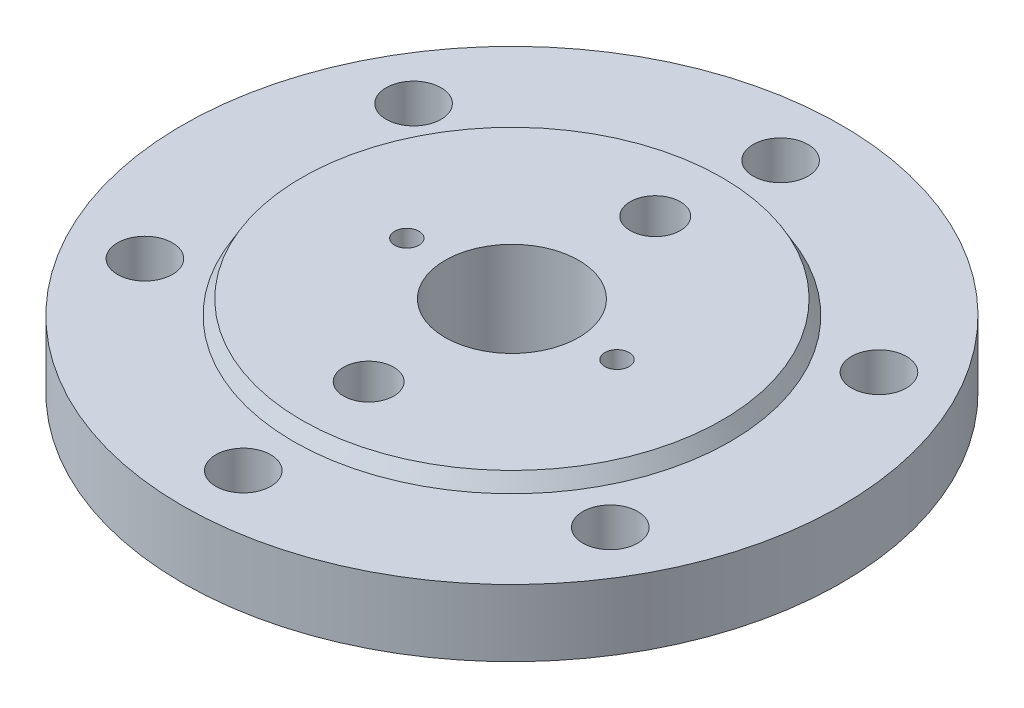
ISO-10303-21;
HEADER;
FILE_DESCRIPTION(('STEP AP214'),'2;1');
FILE_NAME('part.step','',(''),(''),'','','');
FILE_SCHEMA(('AUTOMOTIVE_DESIGN { 1 0 10303 214 1 1 1 1 }'));
ENDSEC;
DATA;
#1=APPLICATION_CONTEXT('core data for automotive mechanical design processes');
#2=APPLICATION_PROTOCOL_DEFINITION('international standard','automotive_design',2000,#1);
#3=PRODUCT_CONTEXT('',#1,'mechanical');
#4=PRODUCT('Part','Part','',(#3));
#5=PRODUCT_RELATED_PRODUCT_CATEGORY('part','',(#4));
#6=PRODUCT_DEFINITION_FORMATION('','',#4);
#7=PRODUCT_DEFINITION_CONTEXT('part definition',#1,'design');
#8=PRODUCT_DEFINITION('design','',#6,#7);
#9=PRODUCT_DEFINITION_SHAPE('','',#8);
#10=(LENGTH_UNIT() NAMED_UNIT(*) SI_UNIT(.MILLI.,.METRE.));
#11=(NAMED_UNIT(*) PLANE_ANGLE_UNIT() SI_UNIT($,.RADIAN.));
#12=(NAMED_UNIT(*) SI_UNIT($,.STERADIAN.) SOLID_ANGLE_UNIT());
#13=UNCERTAINTY_MEASURE_WITH_UNIT(LENGTH_MEASURE(1.E-05),#10,'distance_accuracy_value','');
#14=(GEOMETRIC_REPRESENTATION_CONTEXT(3) GLOBAL_UNCERTAINTY_ASSIGNED_CONTEXT((#13)) GLOBAL_UNIT_ASSIGNED_CONTEXT((#10,
#11,#12)) REPRESENTATION_CONTEXT('',''));
#15=CARTESIAN_POINT('',(0.,0.,0.));
#16=DIRECTION('',(0.,0.,1.));
#17=DIRECTION('',(1.,0.,0.));
#18=AXIS2_PLACEMENT_3D('',#15,#16,#17);
#19=CARTESIAN_POINT('',(35.,-37.771370899436,0.));
#20=DIRECTION('',(0.,1.,0.));
#21=DIRECTION('',(0.,0.,1.));
#22=AXIS2_PLACEMENT_3D('',#19,#20,#21);
#23=PLANE('',#22);
#24=CARTESIAN_POINT('',(0.,-37.771370899436,0.));
#25=DIRECTION('',(0.,1.,0.));
#26=DIRECTION('',(0.,0.,1.));
#27=AXIS2_PLACEMENT_3D('',#24,#25,#26);
#28=CIRCLE('',#27,35.);
#29=CARTESIAN_POINT('',(0.,-37.771370899436,35.));
#30=VERTEX_POINT('',#29);
#31=EDGE_CURVE('E102',#30,#30,#28,.T.);
#32=ORIENTED_EDGE('',*,*,#31,.F.);
#33=EDGE_LOOP('',(#32));
#34=FACE_BOUND('',#33,.T.);
#35=CARTESIAN_POINT('',(0.,-37.771370899436,0.));
#36=DIRECTION('',(0.,1.,0.));
#37=DIRECTION('',(0.,0.,1.));
#38=AXIS2_PLACEMENT_3D('',#35,#36,#37);
#39=CIRCLE('',#38,14.);
#40=CARTESIAN_POINT('',(0.,-37.771370899436,14.));
#41=VERTEX_POINT('',#40);
#42=EDGE_CURVE('E11',#41,#41,#39,.T.);
#43=ORIENTED_EDGE('',*,*,#42,.T.);
#44=EDGE_LOOP('',(#43));
#45=FACE_BOUND('',#44,.T.);
#46=ADVANCED_FACE('F41',(#34,#45),#23,.F.);
#47=CARTESIAN_POINT('',(0.,62.9923492162756,0.));
#48=DIRECTION('',(0.,1.,0.));
#49=DIRECTION('',(0.,0.,1.));
#50=AXIS2_PLACEMENT_3D('',#47,#48,#49);
#51=CYLINDRICAL_SURFACE('',#50,14.);
#52=ORIENTED_EDGE('',*,*,#42,.F.);
#53=EDGE_LOOP('',(#52));
#54=FACE_BOUND('',#53,.T.);
#55=CARTESIAN_POINT('',(0.,-8.70491317374995,0.));
#56=DIRECTION('',(0.,1.,0.));
#57=DIRECTION('',(0.,0.,1.));
#58=AXIS2_PLACEMENT_3D('',#55,#56,#57);
#59=CIRCLE('',#58,14.);
#60=CARTESIAN_POINT('',(0.,-8.70491317374995,14.));
#61=VERTEX_POINT('',#60);
#62=EDGE_CURVE('E48',#61,#61,#59,.T.);
#63=ORIENTED_EDGE('',*,*,#62,.T.);
#64=EDGE_LOOP('',(#63));
#65=FACE_BOUND('',#64,.T.);
#66=ADVANCED_FACE('F159',(#54,#65),#51,.F.);
#67=CARTESIAN_POINT('',(0.,-0.622009405095103,0.));
#68=DIRECTION('',(0.,1.,0.));
#69=DIRECTION('',(0.,0.,1.));
#70=AXIS2_PLACEMENT_3D('',#67,#68,#69);
#71=CONICAL_SURFACE('',#70,28.,1.04719755119659);
#72=ORIENTED_EDGE('',*,*,#62,.F.);
#73=EDGE_LOOP('',(#72));
#74=FACE_BOUND('',#73,.T.);
#75=CARTESIAN_POINT('',(0.,-0.622009405095103,0.));
#76=DIRECTION('',(0.,1.,0.));
#77=DIRECTION('',(0.,0.,1.));
#78=AXIS2_PLACEMENT_3D('',#75,#76,#77);
#79=CIRCLE('',#78,28.);
#80=CARTESIAN_POINT('',(0.,-0.622009405095103,28.));
#81=VERTEX_POINT('',#80);
#82=EDGE_CURVE('E154',#81,#81,#79,.T.);
#83=ORIENTED_EDGE('',*,*,#82,.T.);
#84=EDGE_LOOP('',(#83));
#85=FACE_BOUND('',#84,.T.);
#86=ADVANCED_FACE('F161',(#74,#85),#71,.F.);
#87=CARTESIAN_POINT('',(0.,62.9923492162756,0.));
#88=DIRECTION('',(0.,1.,0.));
#89=DIRECTION('',(0.,0.,1.));
#90=AXIS2_PLACEMENT_3D('',#87,#88,#89);
#91=CYLINDRICAL_SURFACE('',#90,28.);
#92=ORIENTED_EDGE('',*,*,#82,.F.);
#93=EDGE_LOOP('',(#92));
#94=FACE_BOUND('',#93,.T.);
#95=CARTESIAN_POINT('',(0.,49.228629100564,0.));
#96=DIRECTION('',(0.,1.,0.));
#97=DIRECTION('',(0.,0.,1.));
#98=AXIS2_PLACEMENT_3D('',#95,#96,#97);
#99=CIRCLE('',#98,28.);
#100=CARTESIAN_POINT('',(0.,49.228629100564,28.));
#101=VERTEX_POINT('',#100);
#102=EDGE_CURVE('E151',#101,#101,#99,.T.);
#103=ORIENTED_EDGE('',*,*,#102,.T.);
#104=EDGE_LOOP('',(#103));
#105=FACE_BOUND('',#104,.T.);
#106=ADVANCED_FACE('F164',(#94,#105),#91,.F.);
#107=CARTESIAN_POINT('',(28.,49.2286291005639,0.));
#108=DIRECTION('',(0.,-1.,0.));
#109=DIRECTION('',(0.,0.,-1.));
#110=AXIS2_PLACEMENT_3D('',#107,#108,#109);
#111=PLANE('',#110);
#112=CARTESIAN_POINT('',(-44.,49.2286291005639,0.));
#113=DIRECTION('',(0.,1.,0.));
#114=DIRECTION('',(0.,0.,1.));
#115=AXIS2_PLACEMENT_3D('',#112,#113,#114);
#116=CIRCLE('',#115,5.09999999999999);
#117=CARTESIAN_POINT('',(-44.,49.2286291005639,5.09999999999999));
#118=VERTEX_POINT('',#117);
#119=EDGE_CURVE('E72',#118,#118,#116,.T.);
#120=ORIENTED_EDGE('',*,*,#119,.F.);
#121=EDGE_LOOP('',(#120));
#122=FACE_BOUND('',#121,.T.);
#123=CARTESIAN_POINT('',(44.,49.2286291005639,0.));
#124=DIRECTION('',(0.,1.,0.));
#125=DIRECTION('',(0.,0.,1.));
#126=AXIS2_PLACEMENT_3D('',#123,#124,#125);
#127=CIRCLE('',#126,5.09999999999999);
#128=CARTESIAN_POINT('',(44.,49.2286291005639,5.09999999999999));
#129=VERTEX_POINT('',#128);
#130=EDGE_CURVE('E71',#129,#129,#127,.T.);
#131=ORIENTED_EDGE('',*,*,#130,.F.);
#132=EDGE_LOOP('',(#131));
#133=FACE_BOUND('',#132,.T.);
#134=CARTESIAN_POINT('',(0.,49.2286291005639,-60.));
#135=DIRECTION('',(0.,1.,0.));
#136=DIRECTION('',(0.,0.,1.));
#137=AXIS2_PLACEMENT_3D('',#134,#135,#136);
#138=CIRCLE('',#137,10.5);
#139=CARTESIAN_POINT('',(0.,49.2286291005639,-49.5));
#140=VERTEX_POINT('',#139);
#141=EDGE_CURVE('E82',#140,#140,#138,.T.);
#142=ORIENTED_EDGE('',*,*,#141,.F.);
#143=EDGE_LOOP('',(#142));
#144=FACE_BOUND('',#143,.T.);
#145=CARTESIAN_POINT('',(0.,49.2286291005639,60.));
#146=DIRECTION('',(0.,1.,0.));
#147=DIRECTION('',(0.,0.,1.));
#148=AXIS2_PLACEMENT_3D('',#145,#146,#147);
#149=CIRCLE('',#148,10.5);
#150=CARTESIAN_POINT('',(0.,49.2286291005639,70.5));
#151=VERTEX_POINT('',#150);
#152=EDGE_CURVE('E88',#151,#151,#149,.T.);
#153=ORIENTED_EDGE('',*,*,#152,.F.);
#154=EDGE_LOOP('',(#153));
#155=FACE_BOUND('',#154,.T.);
#156=ORIENTED_EDGE('',*,*,#102,.F.);
#157=EDGE_LOOP('',(#156));
#158=FACE_BOUND('',#157,.T.);
#159=CARTESIAN_POINT('',(0.,49.2286291005637,0.));
#160=DIRECTION('',(0.,1.,0.));
#161=DIRECTION('',(0.,0.,1.));
#162=AXIS2_PLACEMENT_3D('',#159,#160,#161);
#163=CIRCLE('',#162,87.9999999999995);
#164=CARTESIAN_POINT('',(0.,49.2286291005637,87.9999999999995));
#165=VERTEX_POINT('',#164);
#166=EDGE_CURVE('E148',#165,#165,#163,.T.);
#167=ORIENTED_EDGE('',*,*,#166,.T.);
#168=EDGE_LOOP('',(#167));
#169=FACE_BOUND('',#168,.T.);
#170=ADVANCED_FACE('F170',(#122,#133,#144,#155,#158,#169),#111,.F.);
#171=CARTESIAN_POINT('',(0.,43.2286291005637,0.));
#172=DIRECTION('',(0.,-1.,0.));
#173=DIRECTION('',(0.,0.,-1.));
#174=AXIS2_PLACEMENT_3D('',#171,#172,#173);
#175=CONICAL_SURFACE('',#174,91.4641016151374,0.523598775598304);
#176=ORIENTED_EDGE('',*,*,#166,.F.);
#177=EDGE_LOOP('',(#176));
#178=FACE_BOUND('',#177,.T.);
#179=CARTESIAN_POINT('',(0.,43.2286291005637,0.));
#180=DIRECTION('',(0.,1.,0.));
#181=DIRECTION('',(0.,0.,1.));
#182=AXIS2_PLACEMENT_3D('',#179,#180,#181);
#183=CIRCLE('',#182,91.4641016151374);
#184=CARTESIAN_POINT('',(0.,43.2286291005637,91.4641016151374));
#185=VERTEX_POINT('',#184);
#186=EDGE_CURVE('E145',#185,#185,#183,.T.);
#187=ORIENTED_EDGE('',*,*,#186,.T.);
#188=EDGE_LOOP('',(#187));
#189=FACE_BOUND('',#188,.T.);
#190=ADVANCED_FACE('F176',(#178,#189),#175,.T.);
#191=CARTESIAN_POINT('',(91.4641016151374,43.2286291005639,0.));
#192=DIRECTION('',(0.,-1.,0.));
#193=DIRECTION('',(0.,0.,-1.));
#194=AXIS2_PLACEMENT_3D('',#191,#192,#193);
#195=PLANE('',#194);
#196=CARTESIAN_POINT('',(0.,43.2286291005639,-112.5));
#197=DIRECTION('',(0.,1.,0.));
#198=DIRECTION('',(0.,0.,1.));
#199=AXIS2_PLACEMENT_3D('',#196,#197,#198);
#200=CIRCLE('',#199,11.5);
#201=CARTESIAN_POINT('',(0.,43.2286291005639,-101.));
#202=VERTEX_POINT('',#201);
#203=EDGE_CURVE('E95',#202,#202,#200,.T.);
#204=ORIENTED_EDGE('',*,*,#203,.F.);
#205=EDGE_LOOP('',(#204));
#206=FACE_BOUND('',#205,.T.);
#207=CARTESIAN_POINT('',(-97.4278579257454,43.2286291005639,-56.249999999993));
#208=DIRECTION('',(0.,1.,0.));
#209=DIRECTION('',(0.,0.,1.));
#210=AXIS2_PLACEMENT_3D('',#207,#208,#209);
#211=CIRCLE('',#210,11.5000000000072);
#212=CARTESIAN_POINT('',(-97.4278579257454,43.2286291005639,-44.7499999999858));
#213=VERTEX_POINT('',#212);
#214=EDGE_CURVE('E94',#213,#213,#211,.T.);
#215=ORIENTED_EDGE('',*,*,#214,.F.);
#216=EDGE_LOOP('',(#215));
#217=FACE_BOUND('',#216,.T.);
#218=CARTESIAN_POINT('',(-97.4278579257374,43.2286291005639,56.2500000000069));
#219=DIRECTION('',(0.,1.,0.));
#220=DIRECTION('',(0.,0.,1.));
#221=AXIS2_PLACEMENT_3D('',#218,#219,#220);
#222=CIRCLE('',#221,11.5000000000145);
#223=CARTESIAN_POINT('',(-97.4278579257374,43.2286291005639,67.7500000000214));
#224=VERTEX_POINT('',#223);
#225=EDGE_CURVE('E108',#224,#224,#222,.T.);
#226=ORIENTED_EDGE('',*,*,#225,.F.);
#227=EDGE_LOOP('',(#226));
#228=FACE_BOUND('',#227,.T.);
#229=CARTESIAN_POINT('',(1.5945879725131E-11,43.2286291005639,112.5));
#230=DIRECTION('',(0.,1.,0.));
#231=DIRECTION('',(0.,0.,1.));
#232=AXIS2_PLACEMENT_3D('',#229,#230,#231);
#233=CIRCLE('',#232,11.500000000016);
#234=CARTESIAN_POINT('',(1.5945879725131E-11,43.2286291005639,124.000000000016));
#235=VERTEX_POINT('',#234);
#236=EDGE_CURVE('E121',#235,#235,#233,.T.);
#237=ORIENTED_EDGE('',*,*,#236,.F.);
#238=EDGE_LOOP('',(#237));
#239=FACE_BOUND('',#238,.T.);
#240=CARTESIAN_POINT('',(97.4278579257613,43.2286291005639,56.2499999999931));
#241=DIRECTION('',(0.,1.,0.));
#242=DIRECTION('',(0.,0.,1.));
#243=AXIS2_PLACEMENT_3D('',#240,#241,#242);
#244=CIRCLE('',#243,11.50000000001);
#245=CARTESIAN_POINT('',(97.4278579257613,43.2286291005639,67.750000000003));
#246=VERTEX_POINT('',#245);
#247=EDGE_CURVE('E115',#246,#246,#244,.T.);
#248=ORIENTED_EDGE('',*,*,#247,.F.);
#249=EDGE_LOOP('',(#248));
#250=FACE_BOUND('',#249,.T.);
#251=CARTESIAN_POINT('',(97.4278579257533,43.2286291005639,-56.2500000000069));
#252=DIRECTION('',(0.,1.,0.));
#253=DIRECTION('',(0.,0.,1.));
#254=AXIS2_PLACEMENT_3D('',#251,#252,#253);
#255=CIRCLE('',#254,11.5000000000021);
#256=CARTESIAN_POINT('',(97.4278579257533,43.2286291005639,-44.7500000000049));
#257=VERTEX_POINT('',#256);
#258=EDGE_CURVE('E109',#257,#257,#255,.T.);
#259=ORIENTED_EDGE('',*,*,#258,.F.);
#260=EDGE_LOOP('',(#259));
#261=FACE_BOUND('',#260,.T.);
#262=ORIENTED_EDGE('',*,*,#186,.F.);
#263=EDGE_LOOP('',(#262));
#264=FACE_BOUND('',#263,.T.);
#265=CARTESIAN_POINT('',(0.,43.228629100564,0.));
#266=DIRECTION('',(0.,1.,0.));
#267=DIRECTION('',(0.,0.,1.));
#268=AXIS2_PLACEMENT_3D('',#265,#266,#267);
#269=CIRCLE('',#268,138.);
#270=CARTESIAN_POINT('',(0.,43.228629100564,138.));
#271=VERTEX_POINT('',#270);
#272=EDGE_CURVE('E142',#271,#271,#269,.T.);
#273=ORIENTED_EDGE('',*,*,#272,.T.);
#274=EDGE_LOOP('',(#273));
#275=FACE_BOUND('',#274,.T.);
#276=ADVANCED_FACE('F183',(#206,#217,#228,#239,#250,#261,#264,#275),#195,.F.);
#277=CARTESIAN_POINT('',(0.,62.9923492162756,0.));
#278=DIRECTION('',(0.,1.,0.));
#279=DIRECTION('',(0.,0.,1.));
#280=AXIS2_PLACEMENT_3D('',#277,#278,#279);
#281=CYLINDRICAL_SURFACE('',#280,138.);
#282=ORIENTED_EDGE('',*,*,#272,.F.);
#283=EDGE_LOOP('',(#282));
#284=FACE_BOUND('',#283,.T.);
#285=CARTESIAN_POINT('',(0.,15.228629100564,0.));
#286=DIRECTION('',(0.,1.,0.));
#287=DIRECTION('',(0.,0.,1.));
#288=AXIS2_PLACEMENT_3D('',#285,#286,#287);
#289=CIRCLE('',#288,138.);
#290=CARTESIAN_POINT('',(0.,15.228629100564,138.));
#291=VERTEX_POINT('',#290);
#292=EDGE_CURVE('E139',#291,#291,#289,.T.);
#293=ORIENTED_EDGE('',*,*,#292,.T.);
#294=EDGE_LOOP('',(#293));
#295=FACE_BOUND('',#294,.T.);
#296=ADVANCED_FACE('F189',(#284,#295),#281,.T.);
#297=CARTESIAN_POINT('',(138.,15.228629100564,0.));
#298=DIRECTION('',(0.,1.,0.));
#299=DIRECTION('',(0.,0.,1.));
#300=AXIS2_PLACEMENT_3D('',#297,#298,#299);
#301=PLANE('',#300);
#302=CARTESIAN_POINT('',(0.,15.228629100564,-112.5));
#303=DIRECTION('',(0.,1.,0.));
#304=DIRECTION('',(0.,0.,1.));
#305=AXIS2_PLACEMENT_3D('',#302,#303,#304);
#306=CIRCLE('',#305,11.5);
#307=CARTESIAN_POINT('',(0.,15.228629100564,-101.));
#308=VERTEX_POINT('',#307);
#309=EDGE_CURVE('E98',#308,#308,#306,.F.);
#310=ORIENTED_EDGE('',*,*,#309,.F.);
#311=EDGE_LOOP('',(#310));
#312=FACE_BOUND('',#311,.T.);
#313=CARTESIAN_POINT('',(-97.4278579257454,15.228629100564,-56.249999999993));
#314=DIRECTION('',(0.,1.,0.));
#315=DIRECTION('',(0.,0.,1.));
#316=AXIS2_PLACEMENT_3D('',#313,#314,#315);
#317=CIRCLE('',#316,11.5000000000072);
#318=CARTESIAN_POINT('',(-97.4278579257454,15.228629100564,-44.7499999999858));
#319=VERTEX_POINT('',#318);
#320=EDGE_CURVE('E105',#319,#319,#317,.F.);
#321=ORIENTED_EDGE('',*,*,#320,.F.);
#322=EDGE_LOOP('',(#321));
#323=FACE_BOUND('',#322,.T.);
#324=CARTESIAN_POINT('',(-97.4278579257374,15.228629100564,56.2500000000069));
#325=DIRECTION('',(0.,1.,0.));
#326=DIRECTION('',(0.,0.,1.));
#327=AXIS2_PLACEMENT_3D('',#324,#325,#326);
#328=CIRCLE('',#327,11.5000000000145);
#329=CARTESIAN_POINT('',(-97.4278579257374,15.228629100564,67.7500000000214));
#330=VERTEX_POINT('',#329);
#331=EDGE_CURVE('E124',#330,#330,#328,.F.);
#332=ORIENTED_EDGE('',*,*,#331,.F.);
#333=EDGE_LOOP('',(#332));
#334=FACE_BOUND('',#333,.T.);
#335=CARTESIAN_POINT('',(1.5945879725131E-11,15.228629100564,112.5));
#336=DIRECTION('',(0.,1.,0.));
#337=DIRECTION('',(0.,0.,1.));
#338=AXIS2_PLACEMENT_3D('',#335,#336,#337);
#339=CIRCLE('',#338,11.500000000016);
#340=CARTESIAN_POINT('',(1.5945879725131E-11,15.228629100564,124.000000000016));
#341=VERTEX_POINT('',#340);
#342=EDGE_CURVE('E118',#341,#341,#339,.F.);
#343=ORIENTED_EDGE('',*,*,#342,.F.);
#344=EDGE_LOOP('',(#343));
#345=FACE_BOUND('',#344,.T.);
#346=CARTESIAN_POINT('',(97.4278579257613,15.228629100564,56.2499999999931));
#347=DIRECTION('',(0.,1.,0.));
#348=DIRECTION('',(0.,0.,1.));
#349=AXIS2_PLACEMENT_3D('',#346,#347,#348);
#350=CIRCLE('',#349,11.50000000001);
#351=CARTESIAN_POINT('',(97.4278579257613,15.228629100564,67.750000000003));
#352=VERTEX_POINT('',#351);
#353=EDGE_CURVE('E112',#352,#352,#350,.F.);
#354=ORIENTED_EDGE('',*,*,#353,.F.);
#355=EDGE_LOOP('',(#354));
#356=FACE_BOUND('',#355,.T.);
#357=CARTESIAN_POINT('',(97.4278579257533,15.228629100564,-56.2500000000069));
#358=DIRECTION('',(0.,1.,0.));
#359=DIRECTION('',(0.,0.,1.));
#360=AXIS2_PLACEMENT_3D('',#357,#358,#359);
#361=CIRCLE('',#360,11.5000000000021);
#362=CARTESIAN_POINT('',(97.4278579257533,15.228629100564,-44.7500000000049));
#363=VERTEX_POINT('',#362);
#364=EDGE_CURVE('E99',#363,#363,#361,.F.);
#365=ORIENTED_EDGE('',*,*,#364,.F.);
#366=EDGE_LOOP('',(#365));
#367=FACE_BOUND('',#366,.T.);
#368=ORIENTED_EDGE('',*,*,#292,.F.);
#369=EDGE_LOOP('',(#368));
#370=FACE_BOUND('',#369,.T.);
#371=CARTESIAN_POINT('',(0.,15.228629100564,0.));
#372=DIRECTION('',(0.,1.,0.));
#373=DIRECTION('',(0.,0.,1.));
#374=AXIS2_PLACEMENT_3D('',#371,#372,#373);
#375=CIRCLE('',#374,59.901806027542);
#376=CARTESIAN_POINT('',(0.,15.228629100564,59.901806027542));
#377=VERTEX_POINT('',#376);
#378=EDGE_CURVE('E136',#377,#377,#375,.T.);
#379=ORIENTED_EDGE('',*,*,#378,.T.);
#380=EDGE_LOOP('',(#379));
#381=FACE_BOUND('',#380,.T.);
#382=ADVANCED_FACE('F196',(#312,#323,#334,#345,#356,#367,#370,#381),#301,.F.);
#383=CARTESIAN_POINT('',(0.,62.9923492162756,0.));
#384=DIRECTION('',(0.,1.,0.));
#385=DIRECTION('',(0.,0.,1.));
#386=AXIS2_PLACEMENT_3D('',#383,#384,#385);
#387=CYLINDRICAL_SURFACE('',#386,59.901806027542);
#388=ORIENTED_EDGE('',*,*,#378,.F.);
#389=EDGE_LOOP('',(#388));
#390=FACE_BOUND('',#389,.T.);
#391=CARTESIAN_POINT('',(0.,9.22862910056398,0.));
#392=DIRECTION('',(0.,1.,0.));
#393=DIRECTION('',(0.,0.,1.));
#394=AXIS2_PLACEMENT_3D('',#391,#392,#393);
#395=CIRCLE('',#394,59.901806027542);
#396=CARTESIAN_POINT('',(0.,9.22862910056398,59.901806027542));
#397=VERTEX_POINT('',#396);
#398=EDGE_CURVE('E133',#397,#397,#395,.T.);
#399=ORIENTED_EDGE('',*,*,#398,.T.);
#400=EDGE_LOOP('',(#399));
#401=FACE_BOUND('',#400,.T.);
#402=ADVANCED_FACE('F202',(#390,#401),#387,.T.);
#403=CARTESIAN_POINT('',(0.,-37.771370899436,0.));
#404=DIRECTION('',(0.,1.,0.));
#405=DIRECTION('',(0.,0.,1.));
#406=AXIS2_PLACEMENT_3D('',#403,#404,#405);
#407=CONICAL_SURFACE('',#406,35.,0.487222462387778);
#408=ORIENTED_EDGE('',*,*,#398,.F.);
#409=EDGE_LOOP('',(#408));
#410=FACE_BOUND('',#409,.T.);
#411=ORIENTED_EDGE('',*,*,#31,.T.);
#412=EDGE_LOOP('',(#411));
#413=FACE_BOUND('',#412,.T.);
#414=ADVANCED_FACE('F209',(#410,#413),#407,.T.);
#415=CARTESIAN_POINT('',(97.4278579257533,-37.772370899436,-56.2500000000069));
#416=DIRECTION('',(0.,1.,0.));
#417=DIRECTION('',(0.,0.,1.));
#418=AXIS2_PLACEMENT_3D('',#415,#416,#417);
#419=CYLINDRICAL_SURFACE('',#418,11.5000000000021);
#420=ORIENTED_EDGE('',*,*,#258,.T.);
#421=EDGE_LOOP('',(#420));
#422=FACE_BOUND('',#421,.T.);
#423=ORIENTED_EDGE('',*,*,#364,.T.);
#424=EDGE_LOOP('',(#423));
#425=FACE_BOUND('',#424,.T.);
#426=ADVANCED_FACE('F215',(#422,#425),#419,.F.);
#427=CARTESIAN_POINT('',(97.4278579257613,-37.772370899436,56.2499999999931));
#428=DIRECTION('',(0.,1.,0.));
#429=DIRECTION('',(0.,0.,1.));
#430=AXIS2_PLACEMENT_3D('',#427,#428,#429);
#431=CYLINDRICAL_SURFACE('',#430,11.50000000001);
#432=ORIENTED_EDGE('',*,*,#247,.T.);
#433=EDGE_LOOP('',(#432));
#434=FACE_BOUND('',#433,.T.);
#435=ORIENTED_EDGE('',*,*,#353,.T.);
#436=EDGE_LOOP('',(#435));
#437=FACE_BOUND('',#436,.T.);
#438=ADVANCED_FACE('F235',(#434,#437),#431,.F.);
#439=CARTESIAN_POINT('',(1.5945879725131E-11,-37.772370899436,112.5));
#440=DIRECTION('',(0.,1.,0.));
#441=DIRECTION('',(0.,0.,1.));
#442=AXIS2_PLACEMENT_3D('',#439,#440,#441);
#443=CYLINDRICAL_SURFACE('',#442,11.500000000016);
#444=ORIENTED_EDGE('',*,*,#236,.T.);
#445=EDGE_LOOP('',(#444));
#446=FACE_BOUND('',#445,.T.);
#447=ORIENTED_EDGE('',*,*,#342,.T.);
#448=EDGE_LOOP('',(#447));
#449=FACE_BOUND('',#448,.T.);
#450=ADVANCED_FACE('F231',(#446,#449),#443,.F.);
#451=CARTESIAN_POINT('',(-97.4278579257374,-37.772370899436,56.2500000000069));
#452=DIRECTION('',(0.,1.,0.));
#453=DIRECTION('',(0.,0.,1.));
#454=AXIS2_PLACEMENT_3D('',#451,#452,#453);
#455=CYLINDRICAL_SURFACE('',#454,11.5000000000145);
#456=ORIENTED_EDGE('',*,*,#225,.T.);
#457=EDGE_LOOP('',(#456));
#458=FACE_BOUND('',#457,.T.);
#459=ORIENTED_EDGE('',*,*,#331,.T.);
#460=EDGE_LOOP('',(#459));
#461=FACE_BOUND('',#460,.T.);
#462=ADVANCED_FACE('F227',(#458,#461),#455,.F.);
#463=CARTESIAN_POINT('',(-97.4278579257454,-37.772370899436,-56.249999999993));
#464=DIRECTION('',(0.,1.,0.));
#465=DIRECTION('',(0.,0.,1.));
#466=AXIS2_PLACEMENT_3D('',#463,#464,#465);
#467=CYLINDRICAL_SURFACE('',#466,11.5000000000072);
#468=ORIENTED_EDGE('',*,*,#214,.T.);
#469=EDGE_LOOP('',(#468));
#470=FACE_BOUND('',#469,.T.);
#471=ORIENTED_EDGE('',*,*,#320,.T.);
#472=EDGE_LOOP('',(#471));
#473=FACE_BOUND('',#472,.T.);
#474=ADVANCED_FACE('F230',(#470,#473),#467,.F.);
#475=CARTESIAN_POINT('',(0.,-37.772370899436,-112.5));
#476=DIRECTION('',(0.,1.,0.));
#477=DIRECTION('',(0.,0.,1.));
#478=AXIS2_PLACEMENT_3D('',#475,#476,#477);
#479=CYLINDRICAL_SURFACE('',#478,11.5);
#480=ORIENTED_EDGE('',*,*,#203,.T.);
#481=EDGE_LOOP('',(#480));
#482=FACE_BOUND('',#481,.T.);
#483=ORIENTED_EDGE('',*,*,#309,.T.);
#484=EDGE_LOOP('',(#483));
#485=FACE_BOUND('',#484,.T.);
#486=ADVANCED_FACE('F245',(#482,#485),#479,.F.);
#487=CARTESIAN_POINT('',(0.,31.5376656003532,60.));
#488=DIRECTION('',(0.,1.,0.));
#489=DIRECTION('',(0.,0.,1.));
#490=AXIS2_PLACEMENT_3D('',#487,#488,#489);
#491=CONICAL_SURFACE('',#490,10.5,1.02974425867665);
#492=CARTESIAN_POINT('',(0.,25.2286291005639,60.));
#493=VERTEX_POINT('',#492);
#494=VERTEX_LOOP('',#493);
#495=FACE_BOUND('',#494,.T.);
#496=CARTESIAN_POINT('',(0.,31.5376656003532,60.));
#497=DIRECTION('',(0.,1.,0.));
#498=DIRECTION('',(0.,0.,1.));
#499=AXIS2_PLACEMENT_3D('',#496,#497,#498);
#500=CIRCLE('',#499,10.5);
#501=CARTESIAN_POINT('',(0.,31.5376656003532,70.5));
#502=VERTEX_POINT('',#501);
#503=EDGE_CURVE('E91',#502,#502,#500,.T.);
#504=ORIENTED_EDGE('',*,*,#503,.T.);
#505=EDGE_LOOP('',(#504));
#506=FACE_BOUND('',#505,.T.);
#507=ADVANCED_FACE('F249',(#495,#506),#491,.F.);
#508=CARTESIAN_POINT('',(0.,49.2286291005639,60.));
#509=DIRECTION('',(0.,1.,0.));
#510=DIRECTION('',(0.,0.,1.));
#511=AXIS2_PLACEMENT_3D('',#508,#509,#510);
#512=CYLINDRICAL_SURFACE('',#511,10.5);
#513=ORIENTED_EDGE('',*,*,#503,.F.);
#514=EDGE_LOOP('',(#513));
#515=FACE_BOUND('',#514,.T.);
#516=ORIENTED_EDGE('',*,*,#152,.T.);
#517=EDGE_LOOP('',(#516));
#518=FACE_BOUND('',#517,.T.);
#519=ADVANCED_FACE('F253',(#515,#518),#512,.F.);
#520=CARTESIAN_POINT('',(0.,31.5376656003532,-60.));
#521=DIRECTION('',(0.,1.,0.));
#522=DIRECTION('',(0.,0.,1.));
#523=AXIS2_PLACEMENT_3D('',#520,#521,#522);
#524=CONICAL_SURFACE('',#523,10.5,1.02974425867665);
#525=CARTESIAN_POINT('',(0.,25.2286291005639,-60.));
#526=VERTEX_POINT('',#525);
#527=VERTEX_LOOP('',#526);
#528=FACE_BOUND('',#527,.T.);
#529=CARTESIAN_POINT('',(0.,31.5376656003532,-60.));
#530=DIRECTION('',(0.,1.,0.));
#531=DIRECTION('',(0.,0.,1.));
#532=AXIS2_PLACEMENT_3D('',#529,#530,#531);
#533=CIRCLE('',#532,10.5);
#534=CARTESIAN_POINT('',(0.,31.5376656003532,-49.5));
#535=VERTEX_POINT('',#534);
#536=EDGE_CURVE('E85',#535,#535,#533,.T.);
#537=ORIENTED_EDGE('',*,*,#536,.T.);
#538=EDGE_LOOP('',(#537));
#539=FACE_BOUND('',#538,.T.);
#540=ADVANCED_FACE('F256',(#528,#539),#524,.F.);
#541=CARTESIAN_POINT('',(0.,49.2286291005639,-60.));
#542=DIRECTION('',(0.,1.,0.));
#543=DIRECTION('',(0.,0.,1.));
#544=AXIS2_PLACEMENT_3D('',#541,#542,#543);
#545=CYLINDRICAL_SURFACE('',#544,10.5);
#546=ORIENTED_EDGE('',*,*,#536,.F.);
#547=EDGE_LOOP('',(#546));
#548=FACE_BOUND('',#547,.T.);
#549=ORIENTED_EDGE('',*,*,#141,.T.);
#550=EDGE_LOOP('',(#549));
#551=FACE_BOUND('',#550,.T.);
#552=ADVANCED_FACE('F260',(#548,#551),#545,.F.);
#553=CARTESIAN_POINT('',(44.,40.2930182576044,0.));
#554=DIRECTION('',(0.,1.,0.));
#555=DIRECTION('',(0.,0.,1.));
#556=AXIS2_PLACEMENT_3D('',#553,#554,#555);
#557=CONICAL_SURFACE('',#556,5.09999999999999,1.02974425867665);
#558=CARTESIAN_POINT('',(44.,37.2286291005639,0.));
#559=VERTEX_POINT('',#558);
#560=VERTEX_LOOP('',#559);
#561=FACE_BOUND('',#560,.T.);
#562=CARTESIAN_POINT('',(44.,40.2930182576044,0.));
#563=DIRECTION('',(0.,1.,0.));
#564=DIRECTION('',(0.,0.,1.));
#565=AXIS2_PLACEMENT_3D('',#562,#563,#564);
#566=CIRCLE('',#565,5.09999999999999);
#567=CARTESIAN_POINT('',(44.,40.2930182576044,5.09999999999999));
#568=VERTEX_POINT('',#567);
#569=EDGE_CURVE('E75',#568,#568,#566,.T.);
#570=ORIENTED_EDGE('',*,*,#569,.T.);
#571=EDGE_LOOP('',(#570));
#572=FACE_BOUND('',#571,.T.);
#573=ADVANCED_FACE('F263',(#561,#572),#557,.F.);
#574=CARTESIAN_POINT('',(44.,49.2286291005639,0.));
#575=DIRECTION('',(0.,1.,0.));
#576=DIRECTION('',(0.,0.,1.));
#577=AXIS2_PLACEMENT_3D('',#574,#575,#576);
#578=CYLINDRICAL_SURFACE('',#577,5.09999999999999);
#579=ORIENTED_EDGE('',*,*,#569,.F.);
#580=EDGE_LOOP('',(#579));
#581=FACE_BOUND('',#580,.T.);
#582=ORIENTED_EDGE('',*,*,#130,.T.);
#583=EDGE_LOOP('',(#582));
#584=FACE_BOUND('',#583,.T.);
#585=ADVANCED_FACE('F65',(#581,#584),#578,.F.);
#586=CARTESIAN_POINT('',(-44.,40.2930182576044,0.));
#587=DIRECTION('',(0.,1.,0.));
#588=DIRECTION('',(0.,0.,1.));
#589=AXIS2_PLACEMENT_3D('',#586,#587,#588);
#590=CONICAL_SURFACE('',#589,5.09999999999999,1.02974425867665);
#591=CARTESIAN_POINT('',(-44.,37.2286291005639,0.));
#592=VERTEX_POINT('',#591);
#593=VERTEX_LOOP('',#592);
#594=FACE_BOUND('',#593,.T.);
#595=CARTESIAN_POINT('',(-44.,40.2930182576044,0.));
#596=DIRECTION('',(0.,1.,0.));
#597=DIRECTION('',(0.,0.,1.));
#598=AXIS2_PLACEMENT_3D('',#595,#596,#597);
#599=CIRCLE('',#598,5.09999999999999);
#600=CARTESIAN_POINT('',(-44.,40.2930182576044,5.09999999999999));
#601=VERTEX_POINT('',#600);
#602=EDGE_CURVE('E69',#601,#601,#599,.T.);
#603=ORIENTED_EDGE('',*,*,#602,.T.);
#604=EDGE_LOOP('',(#603));
#605=FACE_BOUND('',#604,.T.);
#606=ADVANCED_FACE('F61',(#594,#605),#590,.F.);
#607=CARTESIAN_POINT('',(-44.,49.2286291005639,0.));
#608=DIRECTION('',(0.,1.,0.));
#609=DIRECTION('',(0.,0.,1.));
#610=AXIS2_PLACEMENT_3D('',#607,#608,#609);
#611=CYLINDRICAL_SURFACE('',#610,5.09999999999999);
#612=ORIENTED_EDGE('',*,*,#602,.F.);
#613=EDGE_LOOP('',(#612));
#614=FACE_BOUND('',#613,.T.);
#615=ORIENTED_EDGE('',*,*,#119,.T.);
#616=EDGE_LOOP('',(#615));
#617=FACE_BOUND('',#616,.T.);
#618=ADVANCED_FACE('F64',(#614,#617),#611,.F.);
#619=CLOSED_SHELL('',(#46,#66,#86,#106,#170,#190,#276,#296,#382,#402,#414,#426,#438,#450,#462,
#474,#486,#507,#519,#540,#552,#573,#585,#606,#618));
#620=MANIFOLD_SOLID_BREP('B2',#619);
#621=ADVANCED_BREP_SHAPE_REPRESENTATION('',(#18,#620),#14);
#622=SHAPE_DEFINITION_REPRESENTATION(#9,#621);
ENDSEC;
END-ISO-10303-21;
